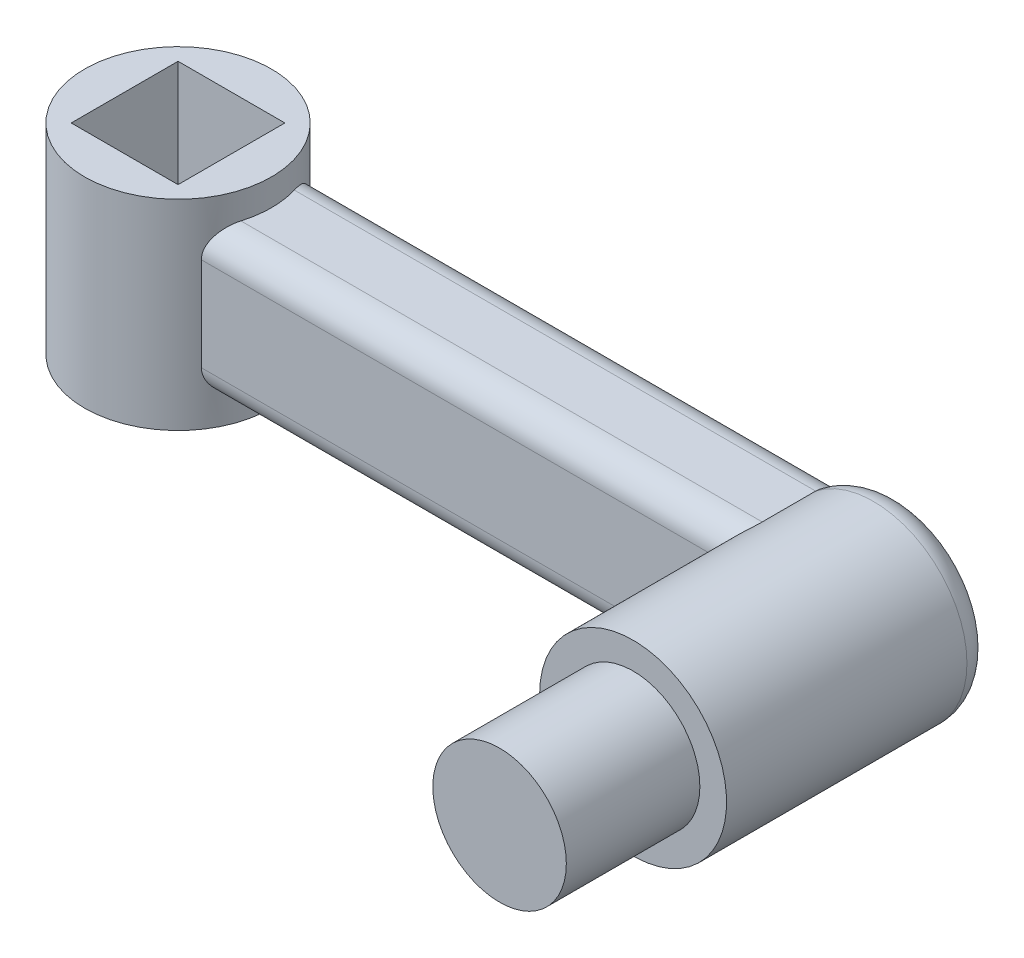
ISO-10303-21;
HEADER;
FILE_DESCRIPTION(('STEP AP214'),'2;1');
FILE_NAME('part.step','',(''),(''),'','','');
FILE_SCHEMA(('AUTOMOTIVE_DESIGN { 1 0 10303 214 1 1 1 1 }'));
ENDSEC;
DATA;
#1=APPLICATION_CONTEXT('core data for automotive mechanical design processes');
#2=APPLICATION_PROTOCOL_DEFINITION('international standard','automotive_design',2000,#1);
#3=PRODUCT_CONTEXT('',#1,'mechanical');
#4=PRODUCT('Part','Part','',(#3));
#5=PRODUCT_RELATED_PRODUCT_CATEGORY('part','',(#4));
#6=PRODUCT_DEFINITION_FORMATION('','',#4);
#7=PRODUCT_DEFINITION_CONTEXT('part definition',#1,'design');
#8=PRODUCT_DEFINITION('design','',#6,#7);
#9=PRODUCT_DEFINITION_SHAPE('','',#8);
#10=(LENGTH_UNIT() NAMED_UNIT(*) SI_UNIT(.MILLI.,.METRE.));
#11=(NAMED_UNIT(*) PLANE_ANGLE_UNIT() SI_UNIT($,.RADIAN.));
#12=(NAMED_UNIT(*) SI_UNIT($,.STERADIAN.) SOLID_ANGLE_UNIT());
#13=UNCERTAINTY_MEASURE_WITH_UNIT(LENGTH_MEASURE(1.E-05),#10,'distance_accuracy_value','');
#14=(GEOMETRIC_REPRESENTATION_CONTEXT(3) GLOBAL_UNCERTAINTY_ASSIGNED_CONTEXT((#13)) GLOBAL_UNIT_ASSIGNED_CONTEXT((#10,
#11,#12)) REPRESENTATION_CONTEXT('',''));
#15=CARTESIAN_POINT('',(0.,0.,0.));
#16=DIRECTION('',(0.,0.,1.));
#17=DIRECTION('',(1.,0.,0.));
#18=AXIS2_PLACEMENT_3D('',#15,#16,#17);
#19=CARTESIAN_POINT('',(-250.,37.5,0.));
#20=DIRECTION('',(0.,-1.,0.));
#21=DIRECTION('',(0.,0.,-1.));
#22=AXIS2_PLACEMENT_3D('',#19,#20,#21);
#23=CYLINDRICAL_SURFACE('',#22,35.);
#24=CARTESIAN_POINT('',(-250.,-37.5,0.));
#25=DIRECTION('',(0.,1.,0.));
#26=DIRECTION('',(0.,0.,1.));
#27=AXIS2_PLACEMENT_3D('',#24,#25,#26);
#28=CIRCLE('',#27,35.);
#29=CARTESIAN_POINT('',(-250.,-37.5,35.));
#30=VERTEX_POINT('',#29);
#31=EDGE_CURVE('E181',#30,#30,#28,.T.);
#32=ORIENTED_EDGE('',*,*,#31,.T.);
#33=EDGE_LOOP('',(#32));
#34=FACE_BOUND('',#33,.T.);
#35=CARTESIAN_POINT('',(-250.,37.5,0.));
#36=DIRECTION('',(0.,1.,0.));
#37=DIRECTION('',(0.,0.,1.));
#38=AXIS2_PLACEMENT_3D('',#35,#36,#37);
#39=CIRCLE('',#38,35.);
#40=CARTESIAN_POINT('',(-250.,37.5,35.));
#41=VERTEX_POINT('',#40);
#42=EDGE_CURVE('E185',#41,#41,#39,.T.);
#43=ORIENTED_EDGE('',*,*,#42,.F.);
#44=EDGE_LOOP('',(#43));
#45=FACE_BOUND('',#44,.T.);
#46=CARTESIAN_POINT('',(-250.,-27.5,0.));
#47=DIRECTION('',(0.,1.,0.));
#48=DIRECTION('',(0.,0.,1.));
#49=AXIS2_PLACEMENT_3D('',#46,#47,#48);
#50=CIRCLE('',#49,35.);
#51=CARTESIAN_POINT('',(-216.458980337503,-27.5,10.));
#52=VERTEX_POINT('',#51);
#53=CARTESIAN_POINT('',(-216.458980337503,-27.5,-9.99999999999998));
#54=VERTEX_POINT('',#53);
#55=EDGE_CURVE('E193',#52,#54,#50,.T.);
#56=ORIENTED_EDGE('',*,*,#55,.F.);
#57=CARTESIAN_POINT('',(-216.458980337503,-27.5,10.));
#58=CARTESIAN_POINT('',(-216.54792941782,-27.5000265555439,10.2984864251879));
#59=CARTESIAN_POINT('',(-216.640919696008,-27.4866385990485,10.5956976142598));
#60=CARTESIAN_POINT('',(-216.833991650693,-27.4339032748398,11.1853166065893));
#61=CARTESIAN_POINT('',(-216.934069631579,-27.3945693479974,11.4777268165737));
#62=CARTESIAN_POINT('',(-217.140075576288,-27.2909831462478,12.0548393307328));
#63=CARTESIAN_POINT('',(-217.245982894395,-27.2268145001115,12.3395641087757));
#64=CARTESIAN_POINT('',(-217.462858644459,-27.0745051743877,12.9005750903631));
#65=CARTESIAN_POINT('',(-217.573827687457,-26.9863615941885,13.1768602683393));
#66=CARTESIAN_POINT('',(-217.799371994255,-26.7872857336393,13.7188025955753));
#67=CARTESIAN_POINT('',(-217.913939254037,-26.6764013659375,13.9844807093508));
#68=CARTESIAN_POINT('',(-218.145647636844,-26.4326224839602,14.5045271964058));
#69=CARTESIAN_POINT('',(-218.262789890675,-26.299718125119,14.7588904462916));
#70=CARTESIAN_POINT('',(-218.49833751405,-26.0126532789174,15.2551894663232));
#71=CARTESIAN_POINT('',(-218.61674424613,-25.8584671449177,15.4971097512134));
#72=CARTESIAN_POINT('',(-218.853161284547,-25.5297984849286,15.9669536490877));
#73=CARTESIAN_POINT('',(-218.971171585565,-25.3553156877412,16.1948770749877));
#74=CARTESIAN_POINT('',(-219.211614852381,-24.9766597613173,16.6476608249617));
#75=CARTESIAN_POINT('',(-219.333932666134,-24.7713797444532,16.8716585547951));
#76=CARTESIAN_POINT('',(-219.574211959138,-24.3399521709682,17.3012138278095));
#77=CARTESIAN_POINT('',(-219.692172958908,-24.1138023270851,17.5067693449061));
#78=CARTESIAN_POINT('',(-219.9213272349,-23.6417788630145,17.8976179704866));
#79=CARTESIAN_POINT('',(-220.032526015472,-23.3959216727355,18.0829276593877));
#80=CARTESIAN_POINT('',(-220.245733209278,-22.8854365189834,18.4316403755011));
#81=CARTESIAN_POINT('',(-220.34774432122,-22.6208141085318,18.5950498424234));
#82=CARTESIAN_POINT('',(-220.519171379559,-22.1331479995194,18.8653268969779));
#83=CARTESIAN_POINT('',(-220.590872715693,-21.9134424345725,18.9767887154495));
#84=CARTESIAN_POINT('',(-220.72562949997,-21.4642146469327,19.1840169338408));
#85=CARTESIAN_POINT('',(-220.78868662049,-21.2346943343826,19.2797863704334));
#86=CARTESIAN_POINT('',(-220.90471067123,-20.7673671598817,19.4544372641888));
#87=CARTESIAN_POINT('',(-220.957697683593,-20.5295779332603,19.5333523725834));
#88=CARTESIAN_POINT('',(-221.052472855952,-20.0467688233093,19.6735306860058));
#89=CARTESIAN_POINT('',(-221.09426392027,-19.8017508335258,19.7347984692092));
#90=CARTESIAN_POINT('',(-221.178061682314,-19.2189925306545,19.8570717449913));
#91=CARTESIAN_POINT('',(-221.21501359063,-18.8788435818078,19.9104640012522));
#92=CARTESIAN_POINT('',(-221.252196955391,-18.3643880878143,19.9640734604129));
#93=CARTESIAN_POINT('',(-221.26155089937,-18.1919712566845,19.9775303181933));
#94=CARTESIAN_POINT('',(-221.274050488975,-17.8463880880213,19.9954967400462));
#95=CARTESIAN_POINT('',(-221.277193969409,-17.6732215101784,20.0000031836829));
#96=CARTESIAN_POINT('',(-221.27718676731,-17.5,20.));
#97=B_SPLINE_CURVE_WITH_KNOTS('',3,(#57,#58,#59,#60,#61,#62,#63,#64,#65,#66,#67,#68,#69,#70,#71,
#72,#73,#74,#75,#76,#77,#78,#79,#80,#81,#82,#83,#84,#85,#86,#87,#88,#89,#90,#91,#92,#93,#94,#95,
#96),.UNSPECIFIED.,.F.,.F.,(4,2,2,2,2,2,2,2,2,2,2,2,2,2,2,2,2,2,2,4),(0.,0.933959431835428,
1.8674354213575,2.79779498400188,3.72826715646908,4.65679869058631,5.58574647275156,
6.51582366490304,7.44591328589923,8.42731152666632,9.40881745337487,10.3895134486974,
11.3699204369359,12.1389251166901,12.9077808081807,13.6750867523123,14.4421934576508,
15.4780741340044,15.9973628952072,16.5168326673559),.UNSPECIFIED.);
#98=CARTESIAN_POINT('',(-221.27718676731,-17.5,20.));
#99=VERTEX_POINT('',#98);
#100=EDGE_CURVE('E276',#52,#99,#97,.T.);
#101=ORIENTED_EDGE('',*,*,#100,.T.);
#102=DIRECTION('',(0.,1.,0.));
#103=VECTOR('',#102,1.);
#104=CARTESIAN_POINT('',(-221.27718676731,-27.5,20.));
#105=LINE('',#104,#103);
#106=CARTESIAN_POINT('',(-221.27718676731,17.5,20.));
#107=VERTEX_POINT('',#106);
#108=EDGE_CURVE('E168',#99,#107,#105,.T.);
#109=ORIENTED_EDGE('',*,*,#108,.T.);
#110=CARTESIAN_POINT('',(-221.27718676731,17.5,20.));
#111=CARTESIAN_POINT('',(-221.277188993638,17.6254566790165,20.0000012117071));
#112=CARTESIAN_POINT('',(-221.275542278216,17.7508952361862,19.9976385230537));
#113=CARTESIAN_POINT('',(-221.268975778246,18.0015025723801,19.9882039044686));
#114=CARTESIAN_POINT('',(-221.264056172754,18.1266713657871,19.9811322321586));
#115=CARTESIAN_POINT('',(-221.244436492633,18.5012233976934,19.9528977738975));
#116=CARTESIAN_POINT('',(-221.224875466156,18.7498740544457,19.9247154765556));
#117=CARTESIAN_POINT('',(-221.173504358664,19.2414501646715,19.8503188234543));
#118=CARTESIAN_POINT('',(-221.141774833384,19.484402348472,19.8042230292689));
#119=CARTESIAN_POINT('',(-221.066893205561,19.9645825860954,19.6946624017916));
#120=CARTESIAN_POINT('',(-221.023739772467,20.2018099696335,19.6311955452527));
#121=CARTESIAN_POINT('',(-220.92718704595,20.6684088584948,19.487918745315));
#122=CARTESIAN_POINT('',(-220.873814689573,20.8977991892978,19.40815173268));
#123=CARTESIAN_POINT('',(-220.757898902128,21.3482531536509,19.2330586749246));
#124=CARTESIAN_POINT('',(-220.69535186759,21.5693134724086,19.1377265147257));
#125=CARTESIAN_POINT('',(-220.56224688146,22.0022989306461,18.9323443447525));
#126=CARTESIAN_POINT('',(-220.491680054229,22.2142135836079,18.82227800398));
#127=CARTESIAN_POINT('',(-220.343808335163,22.6279143875701,18.5884232178567));
#128=CARTESIAN_POINT('',(-220.266500939356,22.8296967303985,18.4646296684701));
#129=CARTESIAN_POINT('',(-220.011839474867,23.4542384865269,18.0505121409273));
#130=CARTESIAN_POINT('',(-219.824002965353,23.8570065326881,17.7359453980246));
#131=CARTESIAN_POINT('',(-219.433315011528,24.6064012143647,17.0538028121799));
#132=CARTESIAN_POINT('',(-219.230455956748,24.9529991064833,16.6862000103435));
#133=CARTESIAN_POINT('',(-218.906289429277,25.45229113217,16.0700502405102));
#134=CARTESIAN_POINT('',(-218.786660529423,25.6251249680456,15.8366563362782));
#135=CARTESIAN_POINT('',(-218.547267695472,25.9498873232126,15.3557056816466));
#136=CARTESIAN_POINT('',(-218.427503748139,26.1018135734111,15.1081473981133));
#137=CARTESIAN_POINT('',(-218.189491325183,26.3837553665281,14.6003477919305));
#138=CARTESIAN_POINT('',(-218.071242172562,26.5137810371651,14.3401124038673));
#139=CARTESIAN_POINT('',(-217.837639693984,26.7510674654686,13.8082192768647));
#140=CARTESIAN_POINT('',(-217.722286143144,26.8583299958586,13.5365624293692));
#141=CARTESIAN_POINT('',(-217.503422790724,27.0426883357496,13.0019307480571));
#142=CARTESIAN_POINT('',(-217.399638106741,27.1213273956808,12.7395999969284));
#143=CARTESIAN_POINT('',(-217.196750630695,27.2571207147149,12.2076971273877));
#144=CARTESIAN_POINT('',(-217.097647149706,27.3142781439045,11.938126083736));
#145=CARTESIAN_POINT('',(-216.904844389779,27.40640626152,11.3927306654457));
#146=CARTESIAN_POINT('',(-216.811155324349,27.4413361881338,11.116895757348));
#147=CARTESIAN_POINT('',(-216.630109365615,27.4881492064746,10.5610828044354));
#148=CARTESIAN_POINT('',(-216.542755520512,27.5000212737719,10.2811028422146));
#149=CARTESIAN_POINT('',(-216.458980337503,27.5,10.));
#150=B_SPLINE_CURVE_WITH_KNOTS('',3,(#110,#111,#112,#113,#114,#115,#116,#117,#118,#119,#120,
#121,#122,#123,#124,#125,#126,#127,#128,#129,#130,#131,#132,#133,#134,#135,#136,#137,#138,#139,
#140,#141,#142,#143,#144,#145,#146,#147,#148,#149),.UNSPECIFIED.,.F.,.F.,(4,2,2,2,2,2,2,2,2,2,2,
2,2,2,2,2,2,2,2,4),(0.,0.376301194395828,0.752581803601404,1.50448023654101,2.251484689093,
2.99857618399806,3.74372480628819,4.48916688260858,5.23544213705747,5.98199580711387,
7.60884640726167,9.23652688870514,10.1779187106722,11.1194126211283,12.0604699439743,
13.001453953247,13.8791783096457,14.7567730876243,15.6359726360553,16.5155924442245),.UNSPECIFIED.);
#151=CARTESIAN_POINT('',(-216.458980337503,27.5,10.));
#152=VERTEX_POINT('',#151);
#153=EDGE_CURVE('E249',#107,#152,#150,.T.);
#154=ORIENTED_EDGE('',*,*,#153,.T.);
#155=CARTESIAN_POINT('',(-250.,27.5,0.));
#156=DIRECTION('',(0.,1.,0.));
#157=DIRECTION('',(0.,0.,1.));
#158=AXIS2_PLACEMENT_3D('',#155,#156,#157);
#159=CIRCLE('',#158,35.);
#160=CARTESIAN_POINT('',(-216.458980337503,27.5,-9.99999999999998));
#161=VERTEX_POINT('',#160);
#162=EDGE_CURVE('E188',#152,#161,#159,.T.);
#163=ORIENTED_EDGE('',*,*,#162,.T.);
#164=CARTESIAN_POINT('',(-216.458980337503,27.5,-9.99999999999998));
#165=CARTESIAN_POINT('',(-216.54792941782,27.5000265555439,-10.2984864251878));
#166=CARTESIAN_POINT('',(-216.640919696008,27.4866385990485,-10.5956976142597));
#167=CARTESIAN_POINT('',(-216.833991650693,27.4339032748398,-11.1853166065893));
#168=CARTESIAN_POINT('',(-216.934069631579,27.3945693479974,-11.4777268165736));
#169=CARTESIAN_POINT('',(-217.140075576288,27.2909831462478,-12.0548393307328));
#170=CARTESIAN_POINT('',(-217.245982894395,27.2268145001115,-12.3395641087757));
#171=CARTESIAN_POINT('',(-217.462858644459,27.0745051743877,-12.9005750903631));
#172=CARTESIAN_POINT('',(-217.573827687457,26.9863615941885,-13.1768602683393));
#173=CARTESIAN_POINT('',(-217.799371994255,26.7872857336393,-13.7188025955753));
#174=CARTESIAN_POINT('',(-217.913939254037,26.6764013659375,-13.9844807093508));
#175=CARTESIAN_POINT('',(-218.145647636844,26.4326224839602,-14.5045271964057));
#176=CARTESIAN_POINT('',(-218.262789890675,26.299718125119,-14.7588904462916));
#177=CARTESIAN_POINT('',(-218.49833751405,26.0126532789174,-15.2551894663232));
#178=CARTESIAN_POINT('',(-218.61674424613,25.8584671449177,-15.4971097512133));
#179=CARTESIAN_POINT('',(-218.853161284547,25.5297984849286,-15.9669536490877));
#180=CARTESIAN_POINT('',(-218.971171585565,25.3553156877412,-16.1948770749877));
#181=CARTESIAN_POINT('',(-219.211614852381,24.9766597613173,-16.6476608249617));
#182=CARTESIAN_POINT('',(-219.333932666134,24.7713797444532,-16.8716585547951));
#183=CARTESIAN_POINT('',(-219.574211959138,24.3399521709682,-17.3012138278095));
#184=CARTESIAN_POINT('',(-219.692172958908,24.1138023270851,-17.5067693449061));
#185=CARTESIAN_POINT('',(-219.9213272349,23.6417788630145,-17.8976179704865));
#186=CARTESIAN_POINT('',(-220.032526015472,23.3959216727355,-18.0829276593877));
#187=CARTESIAN_POINT('',(-220.245733209278,22.8854365189834,-18.4316403755011));
#188=CARTESIAN_POINT('',(-220.34774432122,22.6208141085318,-18.5950498424234));
#189=CARTESIAN_POINT('',(-220.519171379559,22.1331479995194,-18.8653268969779));
#190=CARTESIAN_POINT('',(-220.590872715693,21.9134424345725,-18.9767887154495));
#191=CARTESIAN_POINT('',(-220.72562949997,21.4642146469327,-19.1840169338407));
#192=CARTESIAN_POINT('',(-220.78868662049,21.2346943343826,-19.2797863704334));
#193=CARTESIAN_POINT('',(-220.90471067123,20.7673671598817,-19.4544372641887));
#194=CARTESIAN_POINT('',(-220.957697683593,20.5295779332603,-19.5333523725834));
#195=CARTESIAN_POINT('',(-221.052472855952,20.0467688233093,-19.6735306860058));
#196=CARTESIAN_POINT('',(-221.09426392027,19.8017508335258,-19.7347984692092));
#197=CARTESIAN_POINT('',(-221.178061682314,19.2189925306545,-19.8570717449912));
#198=CARTESIAN_POINT('',(-221.21501359063,18.8788435818078,-19.9104640012522));
#199=CARTESIAN_POINT('',(-221.252196955391,18.3643880878143,-19.9640734604129));
#200=CARTESIAN_POINT('',(-221.26155089937,18.1919712566845,-19.9775303181933));
#201=CARTESIAN_POINT('',(-221.274050488975,17.8463880880213,-19.9954967400461));
#202=CARTESIAN_POINT('',(-221.277193969409,17.6732215101784,-20.0000031836829));
#203=CARTESIAN_POINT('',(-221.27718676731,17.5,-20.));
#204=B_SPLINE_CURVE_WITH_KNOTS('',3,(#164,#165,#166,#167,#168,#169,#170,#171,#172,#173,#174,
#175,#176,#177,#178,#179,#180,#181,#182,#183,#184,#185,#186,#187,#188,#189,#190,#191,#192,#193,
#194,#195,#196,#197,#198,#199,#200,#201,#202,#203),.UNSPECIFIED.,.F.,.F.,(4,2,2,2,2,2,2,2,2,2,2,
2,2,2,2,2,2,2,2,4),(0.,0.933959431835441,1.8674354213575,2.79779498400188,3.72826715646909,
4.6567986905863,5.58574647275156,6.51582366490306,7.44591328589923,8.42731152666632,
9.40881745337486,10.3895134486974,11.3699204369359,12.1389251166901,12.9077808081807,
13.6750867523123,14.4421934576508,15.4780741340044,15.9973628952072,16.5168326673559),.UNSPECIFIED.);
#205=CARTESIAN_POINT('',(-221.27718676731,17.5,-20.));
#206=VERTEX_POINT('',#205);
#207=EDGE_CURVE('E271',#161,#206,#204,.T.);
#208=ORIENTED_EDGE('',*,*,#207,.T.);
#209=DIRECTION('',(0.,1.,0.));
#210=VECTOR('',#209,1.);
#211=CARTESIAN_POINT('',(-221.27718676731,-27.5,-20.));
#212=LINE('',#211,#210);
#213=CARTESIAN_POINT('',(-221.27718676731,-17.5,-20.));
#214=VERTEX_POINT('',#213);
#215=EDGE_CURVE('E175',#214,#206,#212,.T.);
#216=ORIENTED_EDGE('',*,*,#215,.F.);
#217=CARTESIAN_POINT('',(-221.27718676731,-17.5,-20.));
#218=CARTESIAN_POINT('',(-221.277188993637,-17.6254566790165,-20.0000012117071));
#219=CARTESIAN_POINT('',(-221.275542278216,-17.7508952361861,-19.9976385230537));
#220=CARTESIAN_POINT('',(-221.268975778246,-18.0015025723801,-19.9882039044686));
#221=CARTESIAN_POINT('',(-221.264056172754,-18.1266713657871,-19.9811322321585));
#222=CARTESIAN_POINT('',(-221.244436492633,-18.5012233976934,-19.9528977738974));
#223=CARTESIAN_POINT('',(-221.224875466156,-18.7498740544457,-19.9247154765556));
#224=CARTESIAN_POINT('',(-221.173504358664,-19.2414501646715,-19.8503188234542));
#225=CARTESIAN_POINT('',(-221.141774833384,-19.484402348472,-19.8042230292689));
#226=CARTESIAN_POINT('',(-221.066893205561,-19.9645825860954,-19.6946624017916));
#227=CARTESIAN_POINT('',(-221.023739772467,-20.2018099696334,-19.6311955452527));
#228=CARTESIAN_POINT('',(-220.92718704595,-20.6684088584948,-19.487918745315));
#229=CARTESIAN_POINT('',(-220.873814689573,-20.8977991892978,-19.40815173268));
#230=CARTESIAN_POINT('',(-220.757898902128,-21.3482531536509,-19.2330586749246));
#231=CARTESIAN_POINT('',(-220.69535186759,-21.5693134724086,-19.1377265147256));
#232=CARTESIAN_POINT('',(-220.56224688146,-22.0022989306461,-18.9323443447525));
#233=CARTESIAN_POINT('',(-220.491680054229,-22.2142135836079,-18.82227800398));
#234=CARTESIAN_POINT('',(-220.343808335163,-22.6279143875701,-18.5884232178566));
#235=CARTESIAN_POINT('',(-220.266500939356,-22.8296967303985,-18.46462966847));
#236=CARTESIAN_POINT('',(-220.011839474867,-23.4542384865269,-18.0505121409272));
#237=CARTESIAN_POINT('',(-219.824002965353,-23.8570065326881,-17.7359453980246));
#238=CARTESIAN_POINT('',(-219.433315011528,-24.6064012143647,-17.0538028121799));
#239=CARTESIAN_POINT('',(-219.230455956748,-24.9529991064833,-16.6862000103434));
#240=CARTESIAN_POINT('',(-218.906289429277,-25.45229113217,-16.0700502405102));
#241=CARTESIAN_POINT('',(-218.786660529423,-25.6251249680455,-15.8366563362781));
#242=CARTESIAN_POINT('',(-218.547267695472,-25.9498873232126,-15.3557056816466));
#243=CARTESIAN_POINT('',(-218.427503748139,-26.1018135734111,-15.1081473981132));
#244=CARTESIAN_POINT('',(-218.189491325183,-26.383755366528,-14.6003477919305));
#245=CARTESIAN_POINT('',(-218.071242172562,-26.5137810371651,-14.3401124038672));
#246=CARTESIAN_POINT('',(-217.837639693984,-26.7510674654686,-13.8082192768647));
#247=CARTESIAN_POINT('',(-217.722286143144,-26.8583299958586,-13.5365624293692));
#248=CARTESIAN_POINT('',(-217.503422790724,-27.0426883357496,-13.0019307480571));
#249=CARTESIAN_POINT('',(-217.399638106741,-27.1213273956808,-12.7395999969283));
#250=CARTESIAN_POINT('',(-217.196750630695,-27.2571207147149,-12.2076971273877));
#251=CARTESIAN_POINT('',(-217.097647149706,-27.3142781439044,-11.938126083736));
#252=CARTESIAN_POINT('',(-216.904844389779,-27.40640626152,-11.3927306654457));
#253=CARTESIAN_POINT('',(-216.811155324349,-27.4413361881337,-11.1168957573479));
#254=CARTESIAN_POINT('',(-216.630109365615,-27.4881492064746,-10.5610828044353));
#255=CARTESIAN_POINT('',(-216.542755520512,-27.5000212737719,-10.2811028422146));
#256=CARTESIAN_POINT('',(-216.458980337503,-27.5,-9.99999999999998));
#257=B_SPLINE_CURVE_WITH_KNOTS('',3,(#217,#218,#219,#220,#221,#222,#223,#224,#225,#226,#227,
#228,#229,#230,#231,#232,#233,#234,#235,#236,#237,#238,#239,#240,#241,#242,#243,#244,#245,#246,
#247,#248,#249,#250,#251,#252,#253,#254,#255,#256),.UNSPECIFIED.,.F.,.F.,(4,2,2,2,2,2,2,2,2,2,2,
2,2,2,2,2,2,2,2,4),(0.,0.376301194395829,0.752581803601401,1.50448023654102,2.25148468909299,
2.99857618399806,3.7437248062882,4.48916688260859,5.23544213705749,5.98199580711387,
7.60884640726168,9.23652688870514,10.1779187106722,11.1194126211283,12.0604699439743,
13.001453953247,13.8791783096457,14.7567730876243,15.6359726360553,16.5155924442245),.UNSPECIFIED.);
#258=EDGE_CURVE('E215',#214,#54,#257,.T.);
#259=ORIENTED_EDGE('',*,*,#258,.T.);
#260=EDGE_LOOP('',(#56,#101,#109,#154,#163,#208,#216,#259));
#261=FACE_BOUND('',#260,.T.);
#262=ADVANCED_FACE('F41',(#34,#45,#261),#23,.T.);
#263=CARTESIAN_POINT('',(-250.,37.5,0.));
#264=DIRECTION('',(0.,1.,0.));
#265=DIRECTION('',(0.,0.,1.));
#266=AXIS2_PLACEMENT_3D('',#263,#264,#265);
#267=PLANE('',#266);
#268=DIRECTION('',(0.,0.,-1.));
#269=VECTOR('',#268,1.);
#270=CARTESIAN_POINT('',(-230.,37.5,20.));
#271=LINE('',#270,#269);
#272=CARTESIAN_POINT('',(-230.,37.5,20.));
#273=VERTEX_POINT('',#272);
#274=CARTESIAN_POINT('',(-230.,37.5,-20.));
#275=VERTEX_POINT('',#274);
#276=EDGE_CURVE('E144',#273,#275,#271,.T.);
#277=ORIENTED_EDGE('',*,*,#276,.F.);
#278=DIRECTION('',(1.,0.,0.));
#279=VECTOR('',#278,1.);
#280=CARTESIAN_POINT('',(-270.,37.5,20.));
#281=LINE('',#280,#279);
#282=CARTESIAN_POINT('',(-270.,37.5,20.));
#283=VERTEX_POINT('',#282);
#284=EDGE_CURVE('E162',#283,#273,#281,.T.);
#285=ORIENTED_EDGE('',*,*,#284,.F.);
#286=DIRECTION('',(0.,0.,1.));
#287=VECTOR('',#286,1.);
#288=CARTESIAN_POINT('',(-270.,37.5,20.));
#289=LINE('',#288,#287);
#290=CARTESIAN_POINT('',(-270.,37.5,-20.));
#291=VERTEX_POINT('',#290);
#292=EDGE_CURVE('E165',#291,#283,#289,.T.);
#293=ORIENTED_EDGE('',*,*,#292,.F.);
#294=DIRECTION('',(-1.,0.,0.));
#295=VECTOR('',#294,1.);
#296=CARTESIAN_POINT('',(-270.,37.5,-20.));
#297=LINE('',#296,#295);
#298=EDGE_CURVE('E174',#275,#291,#297,.T.);
#299=ORIENTED_EDGE('',*,*,#298,.F.);
#300=EDGE_LOOP('',(#277,#285,#293,#299));
#301=FACE_BOUND('',#300,.T.);
#302=ORIENTED_EDGE('',*,*,#42,.T.);
#303=EDGE_LOOP('',(#302));
#304=FACE_BOUND('',#303,.T.);
#305=ADVANCED_FACE('F344',(#301,#304),#267,.T.);
#306=CARTESIAN_POINT('',(-250.,-37.5,0.));
#307=DIRECTION('',(0.,1.,0.));
#308=DIRECTION('',(0.,0.,1.));
#309=AXIS2_PLACEMENT_3D('',#306,#307,#308);
#310=PLANE('',#309);
#311=DIRECTION('',(1.,0.,0.));
#312=VECTOR('',#311,1.);
#313=CARTESIAN_POINT('',(-270.,-37.5,20.));
#314=LINE('',#313,#312);
#315=CARTESIAN_POINT('',(-270.,-37.5,20.));
#316=VERTEX_POINT('',#315);
#317=CARTESIAN_POINT('',(-230.,-37.5,20.));
#318=VERTEX_POINT('',#317);
#319=EDGE_CURVE('E149',#316,#318,#314,.T.);
#320=ORIENTED_EDGE('',*,*,#319,.T.);
#321=DIRECTION('',(0.,0.,-1.));
#322=VECTOR('',#321,1.);
#323=CARTESIAN_POINT('',(-230.,-37.5,20.));
#324=LINE('',#323,#322);
#325=CARTESIAN_POINT('',(-230.,-37.5,-20.));
#326=VERTEX_POINT('',#325);
#327=EDGE_CURVE('E141',#318,#326,#324,.T.);
#328=ORIENTED_EDGE('',*,*,#327,.T.);
#329=DIRECTION('',(-1.,0.,0.));
#330=VECTOR('',#329,1.);
#331=CARTESIAN_POINT('',(-270.,-37.5,-20.));
#332=LINE('',#331,#330);
#333=CARTESIAN_POINT('',(-270.,-37.5,-20.));
#334=VERTEX_POINT('',#333);
#335=EDGE_CURVE('E153',#326,#334,#332,.T.);
#336=ORIENTED_EDGE('',*,*,#335,.T.);
#337=DIRECTION('',(0.,0.,1.));
#338=VECTOR('',#337,1.);
#339=CARTESIAN_POINT('',(-270.,-37.5,20.));
#340=LINE('',#339,#338);
#341=EDGE_CURVE('E157',#334,#316,#340,.T.);
#342=ORIENTED_EDGE('',*,*,#341,.T.);
#343=EDGE_LOOP('',(#320,#328,#336,#342));
#344=FACE_BOUND('',#343,.T.);
#345=ORIENTED_EDGE('',*,*,#31,.F.);
#346=EDGE_LOOP('',(#345));
#347=FACE_BOUND('',#346,.T.);
#348=ADVANCED_FACE('F159',(#344,#347),#310,.F.);
#349=CARTESIAN_POINT('',(-230.,-37.5,20.));
#350=DIRECTION('',(1.,0.,0.));
#351=DIRECTION('',(0.,0.,-1.));
#352=AXIS2_PLACEMENT_3D('',#349,#350,#351);
#353=PLANE('',#352);
#354=ORIENTED_EDGE('',*,*,#276,.T.);
#355=DIRECTION('',(0.,1.,0.));
#356=VECTOR('',#355,1.);
#357=CARTESIAN_POINT('',(-230.,-37.5,-20.));
#358=LINE('',#357,#356);
#359=EDGE_CURVE('E137',#326,#275,#358,.T.);
#360=ORIENTED_EDGE('',*,*,#359,.F.);
#361=ORIENTED_EDGE('',*,*,#327,.F.);
#362=DIRECTION('',(0.,1.,0.));
#363=VECTOR('',#362,1.);
#364=CARTESIAN_POINT('',(-230.,-37.5,20.));
#365=LINE('',#364,#363);
#366=EDGE_CURVE('E179',#318,#273,#365,.T.);
#367=ORIENTED_EDGE('',*,*,#366,.T.);
#368=EDGE_LOOP('',(#354,#360,#361,#367));
#369=FACE_BOUND('',#368,.T.);
#370=ADVANCED_FACE('F139',(#369),#353,.F.);
#371=CARTESIAN_POINT('',(-270.,-37.5,20.));
#372=DIRECTION('',(0.,0.,1.));
#373=DIRECTION('',(1.,0.,0.));
#374=AXIS2_PLACEMENT_3D('',#371,#372,#373);
#375=PLANE('',#374);
#376=ORIENTED_EDGE('',*,*,#284,.T.);
#377=ORIENTED_EDGE('',*,*,#366,.F.);
#378=ORIENTED_EDGE('',*,*,#319,.F.);
#379=DIRECTION('',(0.,1.,0.));
#380=VECTOR('',#379,1.);
#381=CARTESIAN_POINT('',(-270.,-37.5,20.));
#382=LINE('',#381,#380);
#383=EDGE_CURVE('E182',#316,#283,#382,.T.);
#384=ORIENTED_EDGE('',*,*,#383,.T.);
#385=EDGE_LOOP('',(#376,#377,#378,#384));
#386=FACE_BOUND('',#385,.T.);
#387=ADVANCED_FACE('F372',(#386),#375,.F.);
#388=CARTESIAN_POINT('',(-270.,-37.5,20.));
#389=DIRECTION('',(-1.,0.,0.));
#390=DIRECTION('',(0.,0.,1.));
#391=AXIS2_PLACEMENT_3D('',#388,#389,#390);
#392=PLANE('',#391);
#393=ORIENTED_EDGE('',*,*,#292,.T.);
#394=ORIENTED_EDGE('',*,*,#383,.F.);
#395=ORIENTED_EDGE('',*,*,#341,.F.);
#396=DIRECTION('',(0.,1.,0.));
#397=VECTOR('',#396,1.);
#398=CARTESIAN_POINT('',(-270.,-37.5,-20.));
#399=LINE('',#398,#397);
#400=EDGE_CURVE('E148',#334,#291,#399,.T.);
#401=ORIENTED_EDGE('',*,*,#400,.T.);
#402=EDGE_LOOP('',(#393,#394,#395,#401));
#403=FACE_BOUND('',#402,.T.);
#404=ADVANCED_FACE('F369',(#403),#392,.F.);
#405=CARTESIAN_POINT('',(-270.,-37.5,-20.));
#406=DIRECTION('',(0.,0.,-1.));
#407=DIRECTION('',(-1.,0.,0.));
#408=AXIS2_PLACEMENT_3D('',#405,#406,#407);
#409=PLANE('',#408);
#410=ORIENTED_EDGE('',*,*,#298,.T.);
#411=ORIENTED_EDGE('',*,*,#400,.F.);
#412=ORIENTED_EDGE('',*,*,#335,.F.);
#413=ORIENTED_EDGE('',*,*,#359,.T.);
#414=EDGE_LOOP('',(#410,#411,#412,#413));
#415=FACE_BOUND('',#414,.T.);
#416=ADVANCED_FACE('F154',(#415),#409,.F.);
#417=CARTESIAN_POINT('',(-21.2771867673098,-27.5,-20.));
#418=DIRECTION('',(0.,0.,-1.));
#419=DIRECTION('',(-1.,0.,0.));
#420=AXIS2_PLACEMENT_3D('',#417,#418,#419);
#421=PLANE('',#420);
#422=CARTESIAN_POINT('',(0.373448327301129,0.,-20.));
#423=DIRECTION('',(0.,0.,-1.));
#424=DIRECTION('',(-1.,0.,0.));
#425=AXIS2_PLACEMENT_3D('',#422,#423,#424);
#426=CIRCLE('',#425,25.);
#427=CARTESIAN_POINT('',(-17.480122744056,17.5,-20.));
#428=VERTEX_POINT('',#427);
#429=CARTESIAN_POINT('',(-17.480122744056,-17.5,-20.));
#430=VERTEX_POINT('',#429);
#431=EDGE_CURVE('E247',#428,#430,#426,.T.);
#432=ORIENTED_EDGE('',*,*,#431,.T.);
#433=DIRECTION('',(-1.,0.,0.));
#434=VECTOR('',#433,1.);
#435=CARTESIAN_POINT('',(-221.27718676731,-17.5,-20.));
#436=LINE('',#435,#434);
#437=EDGE_CURVE('E62',#430,#214,#436,.T.);
#438=ORIENTED_EDGE('',*,*,#437,.T.);
#439=ORIENTED_EDGE('',*,*,#215,.T.);
#440=DIRECTION('',(-1.,0.,0.));
#441=VECTOR('',#440,1.);
#442=CARTESIAN_POINT('',(-21.2771867673098,17.5,-20.));
#443=LINE('',#442,#441);
#444=EDGE_CURVE('E70',#206,#428,#443,.F.);
#445=ORIENTED_EDGE('',*,*,#444,.T.);
#446=EDGE_LOOP('',(#432,#438,#439,#445));
#447=FACE_BOUND('',#446,.T.);
#448=ADVANCED_FACE('F357',(#447),#421,.T.);
#449=CARTESIAN_POINT('',(-21.2771867673098,-27.5,20.));
#450=DIRECTION('',(0.,0.,1.));
#451=DIRECTION('',(1.,0.,0.));
#452=AXIS2_PLACEMENT_3D('',#449,#450,#451);
#453=PLANE('',#452);
#454=ORIENTED_EDGE('',*,*,#108,.F.);
#455=DIRECTION('',(1.,0.,0.));
#456=VECTOR('',#455,1.);
#457=CARTESIAN_POINT('',(-21.2771867673098,-17.5,20.));
#458=LINE('',#457,#456);
#459=CARTESIAN_POINT('',(-29.9374408051543,-17.5,20.));
#460=VERTEX_POINT('',#459);
#461=EDGE_CURVE('E206',#99,#460,#458,.T.);
#462=ORIENTED_EDGE('',*,*,#461,.T.);
#463=CARTESIAN_POINT('',(0.373448327301129,0.,20.));
#464=DIRECTION('',(0.,0.,1.));
#465=DIRECTION('',(1.,0.,0.));
#466=AXIS2_PLACEMENT_3D('',#463,#464,#465);
#467=CIRCLE('',#466,35.);
#468=CARTESIAN_POINT('',(-29.9374408051542,17.5,20.));
#469=VERTEX_POINT('',#468);
#470=EDGE_CURVE('E294',#469,#460,#467,.T.);
#471=ORIENTED_EDGE('',*,*,#470,.F.);
#472=DIRECTION('',(1.,0.,0.));
#473=VECTOR('',#472,1.);
#474=CARTESIAN_POINT('',(-21.2771867673098,17.5,20.));
#475=LINE('',#474,#473);
#476=EDGE_CURVE('E204',#469,#107,#475,.F.);
#477=ORIENTED_EDGE('',*,*,#476,.T.);
#478=EDGE_LOOP('',(#454,#462,#471,#477));
#479=FACE_BOUND('',#478,.T.);
#480=ADVANCED_FACE('F304',(#479),#453,.T.);
#481=CARTESIAN_POINT('',(-250.,-27.5,0.));
#482=DIRECTION('',(0.,1.,0.));
#483=DIRECTION('',(0.,0.,1.));
#484=AXIS2_PLACEMENT_3D('',#481,#482,#483);
#485=PLANE('',#484);
#486=ORIENTED_EDGE('',*,*,#55,.T.);
#487=DIRECTION('',(-1.,0.,0.));
#488=VECTOR('',#487,1.);
#489=CARTESIAN_POINT('',(-21.2771867673099,-27.5,-10.));
#490=LINE('',#489,#488);
#491=CARTESIAN_POINT('',(-21.2771867673098,-27.5,-10.));
#492=VERTEX_POINT('',#491);
#493=EDGE_CURVE('E201',#54,#492,#490,.F.);
#494=ORIENTED_EDGE('',*,*,#493,.T.);
#495=DIRECTION('',(0.,0.,-1.));
#496=VECTOR('',#495,1.);
#497=CARTESIAN_POINT('',(-21.2771867673098,-27.5,20.));
#498=LINE('',#497,#496);
#499=CARTESIAN_POINT('',(-21.2771867673098,-27.5,9.99999999999999));
#500=VERTEX_POINT('',#499);
#501=EDGE_CURVE('E291',#500,#492,#498,.T.);
#502=ORIENTED_EDGE('',*,*,#501,.F.);
#503=DIRECTION('',(1.,0.,0.));
#504=VECTOR('',#503,1.);
#505=CARTESIAN_POINT('',(-221.27718676731,-27.5,10.));
#506=LINE('',#505,#504);
#507=EDGE_CURVE('E199',#500,#52,#506,.F.);
#508=ORIENTED_EDGE('',*,*,#507,.T.);
#509=EDGE_LOOP('',(#486,#494,#502,#508));
#510=FACE_BOUND('',#509,.T.);
#511=ADVANCED_FACE('F299',(#510),#485,.F.);
#512=CARTESIAN_POINT('',(-250.,27.5,0.));
#513=DIRECTION('',(0.,1.,0.));
#514=DIRECTION('',(0.,0.,1.));
#515=AXIS2_PLACEMENT_3D('',#512,#513,#514);
#516=PLANE('',#515);
#517=DIRECTION('',(0.,0.,-1.));
#518=VECTOR('',#517,1.);
#519=CARTESIAN_POINT('',(-21.2771867673098,27.5,20.));
#520=LINE('',#519,#518);
#521=CARTESIAN_POINT('',(-21.2771867673098,27.5,9.99999999999999));
#522=VERTEX_POINT('',#521);
#523=CARTESIAN_POINT('',(-21.2771867673098,27.5,-10.));
#524=VERTEX_POINT('',#523);
#525=EDGE_CURVE('E301',#522,#524,#520,.T.);
#526=ORIENTED_EDGE('',*,*,#525,.T.);
#527=DIRECTION('',(-1.,0.,0.));
#528=VECTOR('',#527,1.);
#529=CARTESIAN_POINT('',(-250.,27.5,-9.99999999999998));
#530=LINE('',#529,#528);
#531=EDGE_CURVE('E212',#524,#161,#530,.T.);
#532=ORIENTED_EDGE('',*,*,#531,.T.);
#533=ORIENTED_EDGE('',*,*,#162,.F.);
#534=DIRECTION('',(1.,0.,0.));
#535=VECTOR('',#534,1.);
#536=CARTESIAN_POINT('',(-250.,27.5,10.));
#537=LINE('',#536,#535);
#538=EDGE_CURVE('E209',#152,#522,#537,.T.);
#539=ORIENTED_EDGE('',*,*,#538,.T.);
#540=EDGE_LOOP('',(#526,#532,#533,#539));
#541=FACE_BOUND('',#540,.T.);
#542=ADVANCED_FACE('F335',(#541),#516,.T.);
#543=CARTESIAN_POINT('',(0.373448327301129,0.,80.));
#544=DIRECTION('',(0.,0.,-1.));
#545=DIRECTION('',(-1.,0.,0.));
#546=AXIS2_PLACEMENT_3D('',#543,#544,#545);
#547=CYLINDRICAL_SURFACE('',#546,35.);
#548=CARTESIAN_POINT('',(0.373448327301129,0.,80.));
#549=DIRECTION('',(0.,0.,-1.));
#550=DIRECTION('',(-1.,0.,0.));
#551=AXIS2_PLACEMENT_3D('',#548,#549,#550);
#552=CIRCLE('',#551,35.);
#553=CARTESIAN_POINT('',(-34.6265516726989,0.,80.));
#554=VERTEX_POINT('',#553);
#555=EDGE_CURVE('E312',#554,#554,#552,.T.);
#556=ORIENTED_EDGE('',*,*,#555,.T.);
#557=EDGE_LOOP('',(#556));
#558=FACE_BOUND('',#557,.T.);
#559=ORIENTED_EDGE('',*,*,#501,.T.);
#560=CARTESIAN_POINT('',(0.373448327301129,0.,-10.));
#561=DIRECTION('',(0.,0.,-1.));
#562=DIRECTION('',(-1.,0.,0.));
#563=AXIS2_PLACEMENT_3D('',#560,#561,#562);
#564=CIRCLE('',#563,35.);
#565=EDGE_CURVE('E245',#492,#524,#564,.F.);
#566=ORIENTED_EDGE('',*,*,#565,.T.);
#567=ORIENTED_EDGE('',*,*,#525,.F.);
#568=CARTESIAN_POINT('',(-21.2771867673098,27.5,9.99999999999999));
#569=CARTESIAN_POINT('',(-21.2771818157031,27.5000024419895,10.1088635642432));
#570=CARTESIAN_POINT('',(-21.2794457791782,27.4982216515037,10.2177061813646));
#571=CARTESIAN_POINT('',(-21.2884592461796,27.4911223656562,10.4350769106426));
#572=CARTESIAN_POINT('',(-21.2952082000369,27.4858043038133,10.5436050597026));
#573=CARTESIAN_POINT('',(-21.3220697906439,27.464614434683,10.8679242629731));
#574=CARTESIAN_POINT('',(-21.3487975792189,27.4435067024221,11.0828792461459));
#575=CARTESIAN_POINT('',(-21.4183437908768,27.3883134019222,11.5053476465585));
#576=CARTESIAN_POINT('',(-21.4609391829452,27.3544076358522,11.7129224399293));
#577=CARTESIAN_POINT('',(-21.5607389686381,27.2744479208041,12.1221824535179));
#578=CARTESIAN_POINT('',(-21.6179486099578,27.2283896078849,12.3238655290835));
#579=CARTESIAN_POINT('',(-21.744789805948,27.1254519726737,12.7188339234345));
#580=CARTESIAN_POINT('',(-21.8143361133283,27.0686467437106,12.912166216746));
#581=CARTESIAN_POINT('',(-21.9643289421575,26.9450029609072,13.2911494216318));
#582=CARTESIAN_POINT('',(-22.0447746362204,26.8781651686095,13.4768009148702));
#583=CARTESIAN_POINT('',(-22.3006300767232,26.6633755950955,14.0231928926044));
#584=CARTESIAN_POINT('',(-22.4901033493201,26.5015103657292,14.3720197134962));
#585=CARTESIAN_POINT('',(-22.8564442417962,26.1805252145949,14.9741350666344));
#586=CARTESIAN_POINT('',(-23.0289447228495,26.0266500284774,15.2330312961054));
#587=CARTESIAN_POINT('',(-23.386372159149,25.7007664382109,15.7302500702268));
#588=CARTESIAN_POINT('',(-23.5713057231201,25.5287483622506,15.9685615169315));
#589=CARTESIAN_POINT('',(-23.9500688797852,25.1681350730707,16.425301909462));
#590=CARTESIAN_POINT('',(-24.1439100660829,24.979517945786,16.6437037726301));
#591=CARTESIAN_POINT('',(-24.5373486034945,24.5871791527304,17.0607238203139));
#592=CARTESIAN_POINT('',(-24.7369450853516,24.3834597607188,17.2593449724545));
#593=CARTESIAN_POINT('',(-25.1473753363677,23.9536893561584,17.6443650774427));
#594=CARTESIAN_POINT('',(-25.3583451463639,23.7270793611992,17.8299941581638));
#595=CARTESIAN_POINT('',(-25.7818271504605,23.2594301456047,18.1801148310274));
#596=CARTESIAN_POINT('',(-25.9943393963632,23.0183904383642,18.3446057097486));
#597=CARTESIAN_POINT('',(-26.418619677287,22.523126217732,18.65175939954));
#598=CARTESIAN_POINT('',(-26.6303883594535,22.2689275545299,18.7944629832085));
#599=CARTESIAN_POINT('',(-27.051916710883,21.7476829418265,19.0577283432627));
#600=CARTESIAN_POINT('',(-27.261676253474,21.4806361885907,19.1782887321639));
#601=CARTESIAN_POINT('',(-27.6872486702509,20.921907459766,19.4013380530102));
#602=CARTESIAN_POINT('',(-27.9028923404834,20.6296573375886,19.5027322396637));
#603=CARTESIAN_POINT('',(-28.3284967037009,20.033285974779,19.6787972369757));
#604=CARTESIAN_POINT('',(-28.5384584531232,19.7291669669633,19.7534730473687));
#605=CARTESIAN_POINT('',(-28.9519505888402,19.1091675321134,19.8747512613821));
#606=CARTESIAN_POINT('',(-29.1554513688288,18.7932443278203,19.9212383360452));
#607=CARTESIAN_POINT('',(-29.4539637703626,18.3128680576314,19.9682082586276));
#608=CARTESIAN_POINT('',(-29.5523915573332,18.1515797424635,19.980071677952));
#609=CARTESIAN_POINT('',(-29.7467994791511,17.827127196506,19.9959672869232));
#610=CARTESIAN_POINT('',(-29.8427793087438,17.6639627354102,19.9999985045789));
#611=CARTESIAN_POINT('',(-29.9374408051542,17.5,20.));
#612=B_SPLINE_CURVE_WITH_KNOTS('',3,(#568,#569,#570,#571,#572,#573,#574,#575,#576,#577,#578,
#579,#580,#581,#582,#583,#584,#585,#586,#587,#588,#589,#590,#591,#592,#593,#594,#595,#596,#597,
#598,#599,#600,#601,#602,#603,#604,#605,#606,#607,#608,#609,#610,#611),.UNSPECIFIED.,.F.,.F.,(4,
2,2,2,2,2,2,2,2,2,2,2,2,2,2,2,2,2,2,2,2,4),(0.,0.326511802649308,0.652983596228463,
1.30464606404599,1.94747479939887,2.59053468742477,3.22931278288843,3.86804241506037,
5.14987178582801,6.18983910732471,7.23036365533795,8.27228312456692,9.31404604235292,
10.3961025345779,11.4781955369829,12.5582380190215,13.6383481530606,14.7684523388701,
15.898344940727,17.0328296340977,17.6006311612674,18.1685031491805),.UNSPECIFIED.);
#613=EDGE_CURVE('E255',#522,#469,#612,.T.);
#614=ORIENTED_EDGE('',*,*,#613,.T.);
#615=ORIENTED_EDGE('',*,*,#470,.T.);
#616=CARTESIAN_POINT('',(-29.9374408051543,-17.5,20.));
#617=CARTESIAN_POINT('',(-29.8304288385938,-17.6853570243448,19.9999975535706));
#618=CARTESIAN_POINT('',(-29.7217338613876,-17.8696875429253,19.9948462521923));
#619=CARTESIAN_POINT('',(-29.5012530414601,-18.2358946587221,19.9745725674082));
#620=CARTESIAN_POINT('',(-29.3894677442209,-18.4177716806854,19.9594519330896));
#621=CARTESIAN_POINT('',(-29.0501157504408,-18.9587656043798,19.8996730409589));
#622=CARTESIAN_POINT('',(-28.8182832193866,-19.3137121710059,19.8405961237522));
#623=CARTESIAN_POINT('',(-28.346635727522,-20.0083123783582,19.6868231818343));
#624=CARTESIAN_POINT('',(-28.1068510375379,-20.3480145174667,19.5922506411399));
#625=CARTESIAN_POINT('',(-27.6208633397441,-21.0116072021338,19.3696904947803));
#626=CARTESIAN_POINT('',(-27.3746590337563,-21.335494510968,19.2416960826088));
#627=CARTESIAN_POINT('',(-26.9020834344134,-21.9357497777108,18.9678509585437));
#628=CARTESIAN_POINT('',(-26.6760575031824,-22.2137050714987,18.824863470724));
#629=CARTESIAN_POINT('',(-26.22286975877,-22.7543455458161,18.5140513422441));
#630=CARTESIAN_POINT('',(-25.9957080443032,-23.0170320291895,18.3462288250313));
#631=CARTESIAN_POINT('',(-25.5421886749971,-23.5265000887299,17.9861582141657));
#632=CARTESIAN_POINT('',(-25.3158321857371,-23.7732637727193,17.7938833402613));
#633=CARTESIAN_POINT('',(-24.8667366240526,-24.2495385980168,17.3852674403934));
#634=CARTESIAN_POINT('',(-24.6439970206402,-24.4790522900462,17.1689299842938));
#635=CARTESIAN_POINT('',(-24.2462494536376,-24.8783926790597,16.75469378732));
#636=CARTESIAN_POINT('',(-24.070101555873,-25.0513572573148,16.5609066680551));
#637=CARTESIAN_POINT('',(-23.7242620176206,-25.3842061426486,16.156930511571));
#638=CARTESIAN_POINT('',(-23.5545706445602,-25.5440899082388,15.9467407960588));
#639=CARTESIAN_POINT('',(-23.2243932093336,-25.8494172984065,15.5098259475596));
#640=CARTESIAN_POINT('',(-23.0638957537515,-25.9948789662864,15.2831221075953));
#641=CARTESIAN_POINT('',(-22.7550473643578,-26.2700477658115,14.8125356210368));
#642=CARTESIAN_POINT('',(-22.6066915181603,-26.3997612793903,14.568659997033));
#643=CARTESIAN_POINT('',(-22.369679197722,-26.6038809743891,14.1420489328972));
#644=CARTESIAN_POINT('',(-22.2768011633444,-26.6829449718475,13.9638751652237));
#645=CARTESIAN_POINT('',(-22.1001574604169,-26.8318911469078,13.5992487590596));
#646=CARTESIAN_POINT('',(-22.0163939072496,-26.9017711937825,13.4127942127602));
#647=CARTESIAN_POINT('',(-21.8599777549033,-27.0311864924141,13.0326005580767));
#648=CARTESIAN_POINT('',(-21.787287854596,-27.0907565695059,12.8388887724997));
#649=CARTESIAN_POINT('',(-21.6545108469284,-27.1988299340274,12.4442781350165));
#650=CARTESIAN_POINT('',(-21.5944157138703,-27.2473402707394,12.2433839560462));
#651=CARTESIAN_POINT('',(-21.4990951634087,-27.3238870180016,11.8759333189673));
#652=CARTESIAN_POINT('',(-21.4613007161423,-27.3540764182653,11.7104890583657));
#653=CARTESIAN_POINT('',(-21.3957535579644,-27.4062693026433,11.3763761789189));
#654=CARTESIAN_POINT('',(-21.367998114943,-27.4282750139904,11.2077084505147));
#655=CARTESIAN_POINT('',(-21.3230218252985,-27.4638683478896,10.8665706623153));
#656=CARTESIAN_POINT('',(-21.3058948102483,-27.4773810037317,10.6940802824249));
#657=CARTESIAN_POINT('',(-21.2829454498193,-27.4954659824244,10.3477371567472));
#658=CARTESIAN_POINT('',(-21.27713292959,-27.5000305350495,10.1738833584041));
#659=CARTESIAN_POINT('',(-21.2771867673099,-27.5,9.99999999999997));
#660=B_SPLINE_CURVE_WITH_KNOTS('',3,(#616,#617,#618,#619,#620,#621,#622,#623,#624,#625,#626,
#627,#628,#629,#630,#631,#632,#633,#634,#635,#636,#637,#638,#639,#640,#641,#642,#643,#644,#645,
#646,#647,#648,#649,#650,#651,#652,#653,#654,#655,#656,#657,#658,#659),.UNSPECIFIED.,.F.,.F.,(4,
2,2,2,2,2,2,2,2,2,2,2,2,2,2,2,2,2,2,2,2,4),(0.,0.641932680723708,1.2837527663873,
2.5657826526735,3.84339327473997,5.12126429085075,6.27738257174363,7.43340205912852,
8.59069870319244,9.74782388208544,10.688667503367,11.6295500517819,12.5692402135092,
13.5085482859449,14.1558521750325,14.8033059780698,15.4485281964113,16.0933380046024,
16.6099750705252,17.1264714279502,17.6474650434107,18.1689108717797),.UNSPECIFIED.);
#661=EDGE_CURVE('E223',#460,#500,#660,.T.);
#662=ORIENTED_EDGE('',*,*,#661,.T.);
#663=EDGE_LOOP('',(#559,#566,#567,#614,#615,#662));
#664=FACE_BOUND('',#663,.T.);
#665=ADVANCED_FACE('F290',(#558,#664),#547,.T.);
#666=CARTESIAN_POINT('',(0.373448327301129,0.,80.));
#667=DIRECTION('',(0.,0.,-1.));
#668=DIRECTION('',(-1.,0.,0.));
#669=AXIS2_PLACEMENT_3D('',#666,#667,#668);
#670=PLANE('',#669);
#671=CARTESIAN_POINT('',(0.373448327301129,0.,80.));
#672=DIRECTION('',(0.,0.,1.));
#673=DIRECTION('',(1.,0.,0.));
#674=AXIS2_PLACEMENT_3D('',#671,#672,#673);
#675=CIRCLE('',#674,25.);
#676=CARTESIAN_POINT('',(25.3734483273011,0.,80.));
#677=VERTEX_POINT('',#676);
#678=EDGE_CURVE('E196',#677,#677,#675,.T.);
#679=ORIENTED_EDGE('',*,*,#678,.F.);
#680=EDGE_LOOP('',(#679));
#681=FACE_BOUND('',#680,.T.);
#682=ORIENTED_EDGE('',*,*,#555,.F.);
#683=EDGE_LOOP('',(#682));
#684=FACE_BOUND('',#683,.T.);
#685=ADVANCED_FACE('F325',(#681,#684),#670,.F.);
#686=CARTESIAN_POINT('',(0.373448327301129,0.,130.));
#687=DIRECTION('',(0.,0.,-1.));
#688=DIRECTION('',(-1.,0.,0.));
#689=AXIS2_PLACEMENT_3D('',#686,#687,#688);
#690=CYLINDRICAL_SURFACE('',#689,25.);
#691=CARTESIAN_POINT('',(0.373448327301129,0.,130.));
#692=DIRECTION('',(0.,0.,1.));
#693=DIRECTION('',(1.,0.,0.));
#694=AXIS2_PLACEMENT_3D('',#691,#692,#693);
#695=CIRCLE('',#694,25.);
#696=CARTESIAN_POINT('',(25.3734483273011,0.,130.));
#697=VERTEX_POINT('',#696);
#698=EDGE_CURVE('E315',#697,#697,#695,.T.);
#699=ORIENTED_EDGE('',*,*,#698,.F.);
#700=EDGE_LOOP('',(#699));
#701=FACE_BOUND('',#700,.T.);
#702=ORIENTED_EDGE('',*,*,#678,.T.);
#703=EDGE_LOOP('',(#702));
#704=FACE_BOUND('',#703,.T.);
#705=ADVANCED_FACE('F322',(#701,#704),#690,.T.);
#706=CARTESIAN_POINT('',(0.373448327301129,0.,130.));
#707=DIRECTION('',(0.,0.,1.));
#708=DIRECTION('',(1.,0.,0.));
#709=AXIS2_PLACEMENT_3D('',#706,#707,#708);
#710=PLANE('',#709);
#711=ORIENTED_EDGE('',*,*,#698,.T.);
#712=EDGE_LOOP('',(#711));
#713=FACE_BOUND('',#712,.T.);
#714=ADVANCED_FACE('F237',(#713),#710,.T.);
#715=CARTESIAN_POINT('',(-21.2771867673098,-17.5,-10.));
#716=DIRECTION('',(1.,0.,0.));
#717=DIRECTION('',(0.,0.,-1.));
#718=AXIS2_PLACEMENT_3D('',#715,#716,#717);
#719=CYLINDRICAL_SURFACE('',#718,10.);
#720=ORIENTED_EDGE('',*,*,#437,.F.);
#721=CARTESIAN_POINT('',(-21.2771867673099,-27.5,-10.));
#722=CARTESIAN_POINT('',(-21.2771955441584,-27.5000374212717,-10.2695567042432));
#723=CARTESIAN_POINT('',(-21.2734116373897,-27.489102522209,-10.5391042498665));
#724=CARTESIAN_POINT('',(-21.2583227880026,-27.445561081977,-11.0761935702953));
#725=CARTESIAN_POINT('',(-21.2470189323061,-27.4129576727415,-11.3437356293203));
#726=CARTESIAN_POINT('',(-21.2169854052496,-27.3264411438489,-11.8743592168166));
#727=CARTESIAN_POINT('',(-21.1982710574604,-27.2725719986253,-12.1374487889391));
#728=CARTESIAN_POINT('',(-21.1535385737063,-27.1440441180279,-12.6578633571447));
#729=CARTESIAN_POINT('',(-21.1275203938749,-27.0693852577918,-12.9151883185957));
#730=CARTESIAN_POINT('',(-21.0683441849188,-26.899972820486,-13.4222760085464));
#731=CARTESIAN_POINT('',(-21.0351864201361,-26.8052199873942,-13.6720390166357));
#732=CARTESIAN_POINT('',(-20.9619334029353,-26.5964781673075,-14.1623406667452));
#733=CARTESIAN_POINT('',(-20.9218379570788,-26.4824886439516,-14.4028790513333));
#734=CARTESIAN_POINT('',(-20.8349451445027,-26.2362711165945,-14.8731951478714));
#735=CARTESIAN_POINT('',(-20.7881470661931,-26.1040411761409,-15.1029717138435));
#736=CARTESIAN_POINT('',(-20.6881232165348,-25.8224863644372,-15.5503219279434));
#737=CARTESIAN_POINT('',(-20.6348973705145,-25.6731612945939,-15.7678954342652));
#738=CARTESIAN_POINT('',(-20.5211504796846,-25.3553972671126,-16.1939330206326));
#739=CARTESIAN_POINT('',(-20.4605013152402,-25.1866268502477,-16.402115607103));
#740=CARTESIAN_POINT('',(-20.3331570185621,-24.8339634412375,-16.803257060696));
#741=CARTESIAN_POINT('',(-20.2664618126769,-24.6500702648726,-16.9962157423107));
#742=CARTESIAN_POINT('',(-20.1273849256522,-24.2686219657387,-17.365887397193));
#743=CARTESIAN_POINT('',(-20.055003220164,-24.0710667844714,-17.5426003008914));
#744=CARTESIAN_POINT('',(-19.9048967931674,-23.663709714314,-17.8789906528563));
#745=CARTESIAN_POINT('',(-19.8271697198865,-23.4539024411407,-18.038660522924));
#746=CARTESIAN_POINT('',(-19.6626322067448,-23.0124940816682,-18.3479783962729));
#747=CARTESIAN_POINT('',(-19.5755598483434,-22.7803270416274,-18.4966798478634));
#748=CARTESIAN_POINT('',(-19.3964576020201,-22.3060775476144,-18.7736543256138));
#749=CARTESIAN_POINT('',(-19.3044294607386,-22.0639985941616,-18.901934486903));
#750=CARTESIAN_POINT('',(-19.1158066838635,-21.5714777967142,-19.1377037441598));
#751=CARTESIAN_POINT('',(-19.0192099532632,-21.3210321317821,-19.2451831842753));
#752=CARTESIAN_POINT('',(-18.8219959680414,-20.8136898819268,-19.4389208022322));
#753=CARTESIAN_POINT('',(-18.7213791633587,-20.5567940201181,-19.5251813472645));
#754=CARTESIAN_POINT('',(-18.4396967391665,-19.8434904383076,-19.7330082744329));
#755=CARTESIAN_POINT('',(-18.2549001077202,-19.3819755459954,-19.8325209355194));
#756=CARTESIAN_POINT('',(-17.8773335593023,-18.4536995560801,-19.9654321827534));
#757=CARTESIAN_POINT('',(-17.6845800290929,-17.9869505539211,-19.9989603419902));
#758=CARTESIAN_POINT('',(-17.4862327424356,-17.514546562323,-19.9999920796535));
#759=CARTESIAN_POINT('',(-17.4831780507067,-17.507273074242,-20.0000000147484));
#760=CARTESIAN_POINT('',(-17.480122744056,-17.5,-20.));
#761=B_SPLINE_CURVE_WITH_KNOTS('',3,(#721,#722,#723,#724,#725,#726,#727,#728,#729,#730,#731,
#732,#733,#734,#735,#736,#737,#738,#739,#740,#741,#742,#743,#744,#745,#746,#747,#748,#749,#750,
#751,#752,#753,#754,#755,#756,#757,#758,#759,#760),.UNSPECIFIED.,.F.,.F.,(4,2,2,2,2,2,2,2,2,2,2,
2,2,2,2,2,2,2,2,4),(0.,0.808408043815126,1.61669926694846,2.42332774434048,3.22996106641496,
4.03656452816022,4.84319048348849,5.64990213842306,6.45662316583273,7.28002997422075,
8.10344681452239,8.92686718077415,9.75065216957252,10.6170777803744,11.4831999974253,
12.3497233156193,13.2161499201312,14.7325027588397,16.2458749681382,16.2695416663673),.UNSPECIFIED.);
#762=EDGE_CURVE('E55',#430,#492,#761,.F.);
#763=ORIENTED_EDGE('',*,*,#762,.T.);
#764=ORIENTED_EDGE('',*,*,#493,.F.);
#765=ORIENTED_EDGE('',*,*,#258,.F.);
#766=EDGE_LOOP('',(#720,#763,#764,#765));
#767=FACE_BOUND('',#766,.T.);
#768=ADVANCED_FACE('F233',(#767),#719,.T.);
#769=CARTESIAN_POINT('',(-21.2771867673098,-17.5,9.99999999999999));
#770=DIRECTION('',(-1.,0.,0.));
#771=DIRECTION('',(0.,0.,1.));
#772=AXIS2_PLACEMENT_3D('',#769,#770,#771);
#773=CYLINDRICAL_SURFACE('',#772,10.);
#774=ORIENTED_EDGE('',*,*,#100,.F.);
#775=ORIENTED_EDGE('',*,*,#507,.F.);
#776=ORIENTED_EDGE('',*,*,#661,.F.);
#777=ORIENTED_EDGE('',*,*,#461,.F.);
#778=EDGE_LOOP('',(#774,#775,#776,#777));
#779=FACE_BOUND('',#778,.T.);
#780=ADVANCED_FACE('F236',(#779),#773,.T.);
#781=CARTESIAN_POINT('',(-250.,17.5,-9.99999999999998));
#782=DIRECTION('',(-1.,0.,0.));
#783=DIRECTION('',(0.,0.,1.));
#784=AXIS2_PLACEMENT_3D('',#781,#782,#783);
#785=CYLINDRICAL_SURFACE('',#784,10.);
#786=ORIENTED_EDGE('',*,*,#531,.F.);
#787=CARTESIAN_POINT('',(-21.2771867673098,27.5,-10.));
#788=CARTESIAN_POINT('',(-21.2771955441583,27.5000374212716,-10.2695567042432));
#789=CARTESIAN_POINT('',(-21.2734116373897,27.4891025222091,-10.5391042498665));
#790=CARTESIAN_POINT('',(-21.2583227880026,27.445561081977,-11.0761935702953));
#791=CARTESIAN_POINT('',(-21.247018932306,27.4129576727415,-11.3437356293203));
#792=CARTESIAN_POINT('',(-21.2169854052495,27.3264411438489,-11.8743592168166));
#793=CARTESIAN_POINT('',(-21.1982710574603,27.2725719986253,-12.1374487889391));
#794=CARTESIAN_POINT('',(-21.1535385737062,27.1440441180279,-12.6578633571447));
#795=CARTESIAN_POINT('',(-21.1275203938749,27.0693852577918,-12.9151883185957));
#796=CARTESIAN_POINT('',(-21.0683441849188,26.899972820486,-13.4222760085464));
#797=CARTESIAN_POINT('',(-21.035186420136,26.8052199873942,-13.6720390166357));
#798=CARTESIAN_POINT('',(-20.9619334029352,26.5964781673075,-14.1623406667452));
#799=CARTESIAN_POINT('',(-20.9218379570787,26.4824886439516,-14.4028790513333));
#800=CARTESIAN_POINT('',(-20.8349451445026,26.2362711165945,-14.8731951478714));
#801=CARTESIAN_POINT('',(-20.7881470661931,26.1040411761409,-15.1029717138435));
#802=CARTESIAN_POINT('',(-20.6881232165347,25.8224863644372,-15.5503219279434));
#803=CARTESIAN_POINT('',(-20.6348973705145,25.6731612945939,-15.7678954342652));
#804=CARTESIAN_POINT('',(-20.5211504796845,25.3553972671126,-16.1939330206326));
#805=CARTESIAN_POINT('',(-20.4605013152401,25.1866268502477,-16.402115607103));
#806=CARTESIAN_POINT('',(-20.3331570185621,24.8339634412376,-16.803257060696));
#807=CARTESIAN_POINT('',(-20.2664618126768,24.6500702648726,-16.9962157423107));
#808=CARTESIAN_POINT('',(-20.1273849256522,24.2686219657387,-17.365887397193));
#809=CARTESIAN_POINT('',(-20.0550032201639,24.0710667844714,-17.5426003008914));
#810=CARTESIAN_POINT('',(-19.9048967931673,23.663709714314,-17.8789906528563));
#811=CARTESIAN_POINT('',(-19.8271697198865,23.4539024411407,-18.038660522924));
#812=CARTESIAN_POINT('',(-19.6626322067448,23.0124940816682,-18.3479783962729));
#813=CARTESIAN_POINT('',(-19.5755598483434,22.7803270416274,-18.4966798478635));
#814=CARTESIAN_POINT('',(-19.3964576020201,22.3060775476144,-18.7736543256138));
#815=CARTESIAN_POINT('',(-19.3044294607385,22.0639985941616,-18.901934486903));
#816=CARTESIAN_POINT('',(-19.1158066838635,21.5714777967141,-19.1377037441598));
#817=CARTESIAN_POINT('',(-19.0192099532632,21.321032131782,-19.2451831842753));
#818=CARTESIAN_POINT('',(-18.8219959680413,20.8136898819268,-19.4389208022322));
#819=CARTESIAN_POINT('',(-18.7213791633584,20.5567940201182,-19.5251813472645));
#820=CARTESIAN_POINT('',(-18.4396967391668,19.8434904383075,-19.7330082744329));
#821=CARTESIAN_POINT('',(-18.2549001077219,19.3819755459948,-19.8325209355194));
#822=CARTESIAN_POINT('',(-17.8773335593006,18.4536995560809,-19.9654321827534));
#823=CARTESIAN_POINT('',(-17.6845800290865,17.9869505539238,-19.9989603419902));
#824=CARTESIAN_POINT('',(-17.4862327424354,17.5145465623232,-19.9999920796535));
#825=CARTESIAN_POINT('',(-17.4831780507066,17.5072730742421,-20.0000000147484));
#826=CARTESIAN_POINT('',(-17.480122744056,17.5,-20.));
#827=B_SPLINE_CURVE_WITH_KNOTS('',3,(#787,#788,#789,#790,#791,#792,#793,#794,#795,#796,#797,
#798,#799,#800,#801,#802,#803,#804,#805,#806,#807,#808,#809,#810,#811,#812,#813,#814,#815,#816,
#817,#818,#819,#820,#821,#822,#823,#824,#825,#826),.UNSPECIFIED.,.F.,.F.,(4,2,2,2,2,2,2,2,2,2,2,
2,2,2,2,2,2,2,2,4),(0.,0.808408043815123,1.61669926694846,2.42332774434048,3.22996106641496,
4.03656452816023,4.8431904834885,5.64990213842306,6.45662316583273,7.28002997422074,
8.10344681452237,8.92686718077414,9.75065216957252,10.6170777803744,11.4831999974254,
12.3497233156194,13.2161499201312,14.7325027588396,16.2458749681381,16.2695416663673),.UNSPECIFIED.);
#828=EDGE_CURVE('E11',#524,#428,#827,.T.);
#829=ORIENTED_EDGE('',*,*,#828,.T.);
#830=ORIENTED_EDGE('',*,*,#444,.F.);
#831=ORIENTED_EDGE('',*,*,#207,.F.);
#832=EDGE_LOOP('',(#786,#829,#830,#831));
#833=FACE_BOUND('',#832,.T.);
#834=ADVANCED_FACE('F264',(#833),#785,.T.);
#835=CARTESIAN_POINT('',(-250.,17.5,10.));
#836=DIRECTION('',(1.,0.,0.));
#837=DIRECTION('',(0.,0.,-1.));
#838=AXIS2_PLACEMENT_3D('',#835,#836,#837);
#839=CYLINDRICAL_SURFACE('',#838,10.);
#840=ORIENTED_EDGE('',*,*,#153,.F.);
#841=ORIENTED_EDGE('',*,*,#476,.F.);
#842=ORIENTED_EDGE('',*,*,#613,.F.);
#843=ORIENTED_EDGE('',*,*,#538,.F.);
#844=EDGE_LOOP('',(#840,#841,#842,#843));
#845=FACE_BOUND('',#844,.T.);
#846=ADVANCED_FACE('F261',(#845),#839,.T.);
#847=CARTESIAN_POINT('',(0.373448327301129,0.,-10.));
#848=DIRECTION('',(0.,0.,-1.));
#849=DIRECTION('',(-1.,0.,0.));
#850=AXIS2_PLACEMENT_3D('',#847,#848,#849);
#851=TOROIDAL_SURFACE('',#850,25.,10.);
#852=ORIENTED_EDGE('',*,*,#828,.F.);
#853=ORIENTED_EDGE('',*,*,#565,.F.);
#854=ORIENTED_EDGE('',*,*,#762,.F.);
#855=ORIENTED_EDGE('',*,*,#431,.F.);
#856=EDGE_LOOP('',(#852,#853,#854,#855));
#857=FACE_BOUND('',#856,.T.);
#858=ADVANCED_FACE('F43',(#857),#851,.T.);
#859=CLOSED_SHELL('',(#262,#305,#348,#370,#387,#404,#416,#448,#480,#511,#542,#665,#685,#705,
#714,#768,#780,#834,#846,#858));
#860=MANIFOLD_SOLID_BREP('B2',#859);
#861=ADVANCED_BREP_SHAPE_REPRESENTATION('',(#18,#860),#14);
#862=SHAPE_DEFINITION_REPRESENTATION(#9,#861);
ENDSEC;
END-ISO-10303-21;
